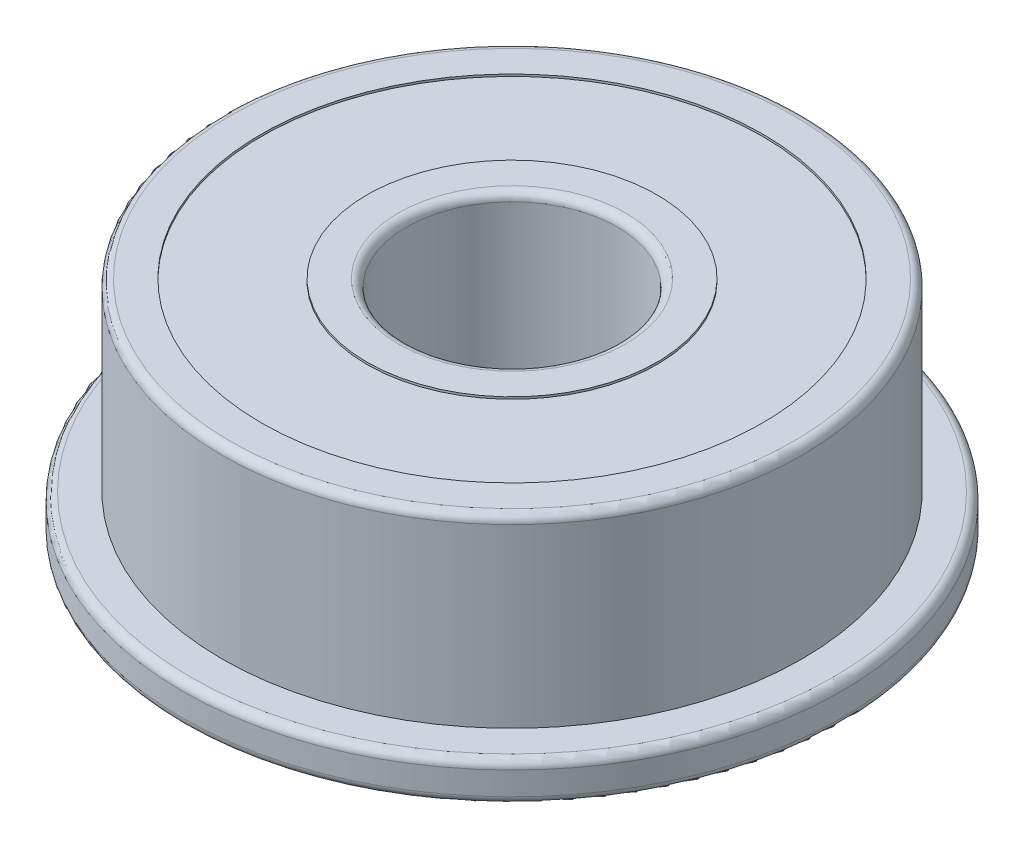
ISO-10303-21;
HEADER;
FILE_DESCRIPTION(('STEP AP214'),'2;1');
FILE_NAME('part.step','',(''),(''),'','','');
FILE_SCHEMA(('AUTOMOTIVE_DESIGN { 1 0 10303 214 1 1 1 1 }'));
ENDSEC;
DATA;
#1=APPLICATION_CONTEXT('core data for automotive mechanical design processes');
#2=APPLICATION_PROTOCOL_DEFINITION('international standard','automotive_design',2000,#1);
#3=PRODUCT_CONTEXT('',#1,'mechanical');
#4=PRODUCT('Part','Part','',(#3));
#5=PRODUCT_RELATED_PRODUCT_CATEGORY('part','',(#4));
#6=PRODUCT_DEFINITION_FORMATION('','',#4);
#7=PRODUCT_DEFINITION_CONTEXT('part definition',#1,'design');
#8=PRODUCT_DEFINITION('design','',#6,#7);
#9=PRODUCT_DEFINITION_SHAPE('','',#8);
#10=(LENGTH_UNIT() NAMED_UNIT(*) SI_UNIT(.MILLI.,.METRE.));
#11=(NAMED_UNIT(*) PLANE_ANGLE_UNIT() SI_UNIT($,.RADIAN.));
#12=(NAMED_UNIT(*) SI_UNIT($,.STERADIAN.) SOLID_ANGLE_UNIT());
#13=UNCERTAINTY_MEASURE_WITH_UNIT(LENGTH_MEASURE(1.E-05),#10,'distance_accuracy_value','');
#14=(GEOMETRIC_REPRESENTATION_CONTEXT(3) GLOBAL_UNCERTAINTY_ASSIGNED_CONTEXT((#13)) GLOBAL_UNIT_ASSIGNED_CONTEXT((#10,
#11,#12)) REPRESENTATION_CONTEXT('',''));
#15=CARTESIAN_POINT('',(0.,0.,0.));
#16=DIRECTION('',(0.,0.,1.));
#17=DIRECTION('',(1.,0.,0.));
#18=AXIS2_PLACEMENT_3D('',#15,#16,#17);
#19=CARTESIAN_POINT('',(0.,8.5,0.));
#20=DIRECTION('',(0.,1.,0.));
#21=DIRECTION('',(0.,0.,1.));
#22=AXIS2_PLACEMENT_3D('',#19,#20,#21);
#23=PLANE('',#22);
#24=CARTESIAN_POINT('',(0.,8.5,0.));
#25=DIRECTION('',(0.,1.,0.));
#26=DIRECTION('',(0.,0.,1.));
#27=AXIS2_PLACEMENT_3D('',#24,#25,#26);
#28=CIRCLE('',#27,4.31);
#29=CARTESIAN_POINT('',(0.,8.5,4.31));
#30=VERTEX_POINT('',#29);
#31=EDGE_CURVE('E10',#30,#30,#28,.F.);
#32=ORIENTED_EDGE('',*,*,#31,.T.);
#33=EDGE_LOOP('',(#32));
#34=FACE_BOUND('',#33,.T.);
#35=CARTESIAN_POINT('',(0.,8.5,0.));
#36=DIRECTION('',(0.,1.,0.));
#37=DIRECTION('',(0.,0.,1.));
#38=AXIS2_PLACEMENT_3D('',#35,#36,#37);
#39=CIRCLE('',#38,5.5);
#40=CARTESIAN_POINT('',(0.,8.5,5.5));
#41=VERTEX_POINT('',#40);
#42=EDGE_CURVE('E93',#41,#41,#39,.T.);
#43=ORIENTED_EDGE('',*,*,#42,.T.);
#44=EDGE_LOOP('',(#43));
#45=FACE_BOUND('',#44,.T.);
#46=ADVANCED_FACE('F33',(#34,#45),#23,.T.);
#47=CARTESIAN_POINT('',(0.,0.,0.));
#48=DIRECTION('',(0.,1.,0.));
#49=DIRECTION('',(0.,0.,1.));
#50=AXIS2_PLACEMENT_3D('',#47,#48,#49);
#51=PLANE('',#50);
#52=CARTESIAN_POINT('',(0.,0.,0.));
#53=DIRECTION('',(0.,1.,0.));
#54=DIRECTION('',(0.,0.,1.));
#55=AXIS2_PLACEMENT_3D('',#52,#53,#54);
#56=CIRCLE('',#55,4.31);
#57=CARTESIAN_POINT('',(0.,0.,4.31));
#58=VERTEX_POINT('',#57);
#59=EDGE_CURVE('E59',#58,#58,#56,.T.);
#60=ORIENTED_EDGE('',*,*,#59,.T.);
#61=EDGE_LOOP('',(#60));
#62=FACE_BOUND('',#61,.T.);
#63=CARTESIAN_POINT('',(0.,0.,0.));
#64=DIRECTION('',(0.,-1.,0.));
#65=DIRECTION('',(0.,0.,-1.));
#66=AXIS2_PLACEMENT_3D('',#63,#64,#65);
#67=CIRCLE('',#66,5.5);
#68=CARTESIAN_POINT('',(0.,0.,-5.5));
#69=VERTEX_POINT('',#68);
#70=EDGE_CURVE('E81',#69,#69,#67,.T.);
#71=ORIENTED_EDGE('',*,*,#70,.T.);
#72=EDGE_LOOP('',(#71));
#73=FACE_BOUND('',#72,.T.);
#74=ADVANCED_FACE('F131',(#62,#73),#51,.F.);
#75=CARTESIAN_POINT('',(0.,1.5,0.));
#76=DIRECTION('',(0.,-1.,0.));
#77=DIRECTION('',(0.,0.,-1.));
#78=AXIS2_PLACEMENT_3D('',#75,#76,#77);
#79=CYLINDRICAL_SURFACE('',#78,12.5);
#80=CARTESIAN_POINT('',(0.,1.19,0.));
#81=DIRECTION('',(0.,1.,0.));
#82=DIRECTION('',(0.,0.,1.));
#83=AXIS2_PLACEMENT_3D('',#80,#81,#82);
#84=CIRCLE('',#83,12.5);
#85=CARTESIAN_POINT('',(0.,1.19,12.5));
#86=VERTEX_POINT('',#85);
#87=EDGE_CURVE('E62',#86,#86,#84,.F.);
#88=ORIENTED_EDGE('',*,*,#87,.T.);
#89=EDGE_LOOP('',(#88));
#90=FACE_BOUND('',#89,.T.);
#91=CARTESIAN_POINT('',(0.,0.31,0.));
#92=DIRECTION('',(0.,1.,0.));
#93=DIRECTION('',(0.,0.,1.));
#94=AXIS2_PLACEMENT_3D('',#91,#92,#93);
#95=CIRCLE('',#94,12.5);
#96=CARTESIAN_POINT('',(0.,0.31,12.5));
#97=VERTEX_POINT('',#96);
#98=EDGE_CURVE('E65',#97,#97,#95,.T.);
#99=ORIENTED_EDGE('',*,*,#98,.T.);
#100=EDGE_LOOP('',(#99));
#101=FACE_BOUND('',#100,.T.);
#102=ADVANCED_FACE('F135',(#90,#101),#79,.T.);
#103=CARTESIAN_POINT('',(0.,1.5,0.));
#104=DIRECTION('',(0.,1.,0.));
#105=DIRECTION('',(0.,0.,1.));
#106=AXIS2_PLACEMENT_3D('',#103,#104,#105);
#107=PLANE('',#106);
#108=CARTESIAN_POINT('',(0.,1.5,0.));
#109=DIRECTION('',(0.,1.,0.));
#110=DIRECTION('',(0.,0.,1.));
#111=AXIS2_PLACEMENT_3D('',#108,#109,#110);
#112=CIRCLE('',#111,12.19);
#113=CARTESIAN_POINT('',(0.,1.5,12.19));
#114=VERTEX_POINT('',#113);
#115=EDGE_CURVE('E68',#114,#114,#112,.T.);
#116=ORIENTED_EDGE('',*,*,#115,.T.);
#117=EDGE_LOOP('',(#116));
#118=FACE_BOUND('',#117,.T.);
#119=CARTESIAN_POINT('',(0.,1.5,0.));
#120=DIRECTION('',(0.,1.,0.));
#121=DIRECTION('',(0.,0.,1.));
#122=AXIS2_PLACEMENT_3D('',#119,#120,#121);
#123=CIRCLE('',#122,11.);
#124=CARTESIAN_POINT('',(0.,1.5,11.));
#125=VERTEX_POINT('',#124);
#126=EDGE_CURVE('E71',#125,#125,#123,.T.);
#127=ORIENTED_EDGE('',*,*,#126,.F.);
#128=EDGE_LOOP('',(#127));
#129=FACE_BOUND('',#128,.T.);
#130=ADVANCED_FACE('F166',(#118,#129),#107,.T.);
#131=CARTESIAN_POINT('',(0.,0.,0.));
#132=DIRECTION('',(0.,1.,0.));
#133=DIRECTION('',(0.,0.,1.));
#134=AXIS2_PLACEMENT_3D('',#131,#132,#133);
#135=CIRCLE('',#134,12.19);
#136=CARTESIAN_POINT('',(0.,0.,12.19));
#137=VERTEX_POINT('',#136);
#138=EDGE_CURVE('E48',#137,#137,#135,.F.);
#139=ORIENTED_EDGE('',*,*,#138,.T.);
#140=EDGE_LOOP('',(#139));
#141=FACE_BOUND('',#140,.T.);
#142=CARTESIAN_POINT('',(0.,0.,0.));
#143=DIRECTION('',(0.,-1.,0.));
#144=DIRECTION('',(0.,0.,-1.));
#145=AXIS2_PLACEMENT_3D('',#142,#143,#144);
#146=CIRCLE('',#145,9.5);
#147=CARTESIAN_POINT('',(0.,0.,-9.5));
#148=VERTEX_POINT('',#147);
#149=EDGE_CURVE('E75',#148,#148,#146,.T.);
#150=ORIENTED_EDGE('',*,*,#149,.F.);
#151=EDGE_LOOP('',(#150));
#152=FACE_BOUND('',#151,.T.);
#153=ADVANCED_FACE('F128',(#141,#152),#51,.F.);
#154=CARTESIAN_POINT('',(0.,8.5,0.));
#155=DIRECTION('',(0.,-1.,0.));
#156=DIRECTION('',(0.,0.,-1.));
#157=AXIS2_PLACEMENT_3D('',#154,#155,#156);
#158=CYLINDRICAL_SURFACE('',#157,11.);
#159=CARTESIAN_POINT('',(0.,8.19,0.));
#160=DIRECTION('',(0.,1.,0.));
#161=DIRECTION('',(0.,0.,1.));
#162=AXIS2_PLACEMENT_3D('',#159,#160,#161);
#163=CIRCLE('',#162,11.);
#164=CARTESIAN_POINT('',(0.,8.19,11.));
#165=VERTEX_POINT('',#164);
#166=EDGE_CURVE('E40',#165,#165,#163,.F.);
#167=ORIENTED_EDGE('',*,*,#166,.T.);
#168=EDGE_LOOP('',(#167));
#169=FACE_BOUND('',#168,.T.);
#170=ORIENTED_EDGE('',*,*,#126,.T.);
#171=EDGE_LOOP('',(#170));
#172=FACE_BOUND('',#171,.T.);
#173=ADVANCED_FACE('F118',(#169,#172),#158,.T.);
#174=CARTESIAN_POINT('',(0.,8.5,0.));
#175=DIRECTION('',(0.,1.,0.));
#176=DIRECTION('',(0.,0.,1.));
#177=AXIS2_PLACEMENT_3D('',#174,#175,#176);
#178=CIRCLE('',#177,10.69);
#179=CARTESIAN_POINT('',(0.,8.5,10.69));
#180=VERTEX_POINT('',#179);
#181=EDGE_CURVE('E44',#180,#180,#178,.T.);
#182=ORIENTED_EDGE('',*,*,#181,.T.);
#183=EDGE_LOOP('',(#182));
#184=FACE_BOUND('',#183,.T.);
#185=CARTESIAN_POINT('',(0.,8.5,0.));
#186=DIRECTION('',(0.,1.,0.));
#187=DIRECTION('',(0.,0.,1.));
#188=AXIS2_PLACEMENT_3D('',#185,#186,#187);
#189=CIRCLE('',#188,9.5);
#190=CARTESIAN_POINT('',(0.,8.5,9.5));
#191=VERTEX_POINT('',#190);
#192=EDGE_CURVE('E87',#191,#191,#189,.T.);
#193=ORIENTED_EDGE('',*,*,#192,.F.);
#194=EDGE_LOOP('',(#193));
#195=FACE_BOUND('',#194,.T.);
#196=ADVANCED_FACE('F115',(#184,#195),#23,.T.);
#197=CARTESIAN_POINT('',(0.,0.,0.));
#198=DIRECTION('',(0.,1.,0.));
#199=DIRECTION('',(0.,0.,1.));
#200=AXIS2_PLACEMENT_3D('',#197,#198,#199);
#201=CYLINDRICAL_SURFACE('',#200,4.);
#202=CARTESIAN_POINT('',(0.,0.31,0.));
#203=DIRECTION('',(0.,1.,0.));
#204=DIRECTION('',(0.,0.,1.));
#205=AXIS2_PLACEMENT_3D('',#202,#203,#204);
#206=CIRCLE('',#205,4.);
#207=CARTESIAN_POINT('',(0.,0.31,4.));
#208=VERTEX_POINT('',#207);
#209=EDGE_CURVE('E53',#208,#208,#206,.F.);
#210=ORIENTED_EDGE('',*,*,#209,.T.);
#211=EDGE_LOOP('',(#210));
#212=FACE_BOUND('',#211,.T.);
#213=CARTESIAN_POINT('',(0.,8.19,0.));
#214=DIRECTION('',(0.,1.,0.));
#215=DIRECTION('',(0.,0.,1.));
#216=AXIS2_PLACEMENT_3D('',#213,#214,#215);
#217=CIRCLE('',#216,4.);
#218=CARTESIAN_POINT('',(0.,8.19,4.));
#219=VERTEX_POINT('',#218);
#220=EDGE_CURVE('E56',#219,#219,#217,.T.);
#221=ORIENTED_EDGE('',*,*,#220,.T.);
#222=EDGE_LOOP('',(#221));
#223=FACE_BOUND('',#222,.T.);
#224=ADVANCED_FACE('F117',(#212,#223),#201,.F.);
#225=CARTESIAN_POINT('',(0.,0.08,0.));
#226=DIRECTION('',(0.,-1.,0.));
#227=DIRECTION('',(0.,0.,-1.));
#228=AXIS2_PLACEMENT_3D('',#225,#226,#227);
#229=CYLINDRICAL_SURFACE('',#228,9.5);
#230=CARTESIAN_POINT('',(0.,0.08,0.));
#231=DIRECTION('',(0.,-1.,0.));
#232=DIRECTION('',(0.,0.,-1.));
#233=AXIS2_PLACEMENT_3D('',#230,#231,#232);
#234=CIRCLE('',#233,9.5);
#235=CARTESIAN_POINT('',(0.,0.08,-9.5));
#236=VERTEX_POINT('',#235);
#237=EDGE_CURVE('E74',#236,#236,#234,.T.);
#238=CARTESIAN_POINT('',(0.,0.08,-9.5));
#239=CARTESIAN_POINT('',(0.,0.0791666666666667,-9.5));
#240=CARTESIAN_POINT('',(0.,0.0783333333333333,-9.5));
#241=CARTESIAN_POINT('',(0.,0.0766666666666667,-9.5));
#242=CARTESIAN_POINT('',(0.,0.0758333333333333,-9.5));
#243=CARTESIAN_POINT('',(0.,0.0741666666666667,-9.5));
#244=CARTESIAN_POINT('',(0.,0.0733333333333333,-9.5));
#245=CARTESIAN_POINT('',(0.,0.0716666666666667,-9.5));
#246=CARTESIAN_POINT('',(0.,0.0708333333333333,-9.5));
#247=CARTESIAN_POINT('',(0.,0.0691666666666667,-9.5));
#248=CARTESIAN_POINT('',(0.,0.0683333333333333,-9.5));
#249=CARTESIAN_POINT('',(0.,0.0666666666666667,-9.5));
#250=CARTESIAN_POINT('',(0.,0.0658333333333333,-9.5));
#251=CARTESIAN_POINT('',(0.,0.0641666666666667,-9.5));
#252=CARTESIAN_POINT('',(0.,0.0633333333333333,-9.5));
#253=CARTESIAN_POINT('',(0.,0.0616666666666667,-9.5));
#254=CARTESIAN_POINT('',(0.,0.0608333333333333,-9.5));
#255=CARTESIAN_POINT('',(0.,0.0591666666666667,-9.5));
#256=CARTESIAN_POINT('',(0.,0.0583333333333333,-9.5));
#257=CARTESIAN_POINT('',(0.,0.0566666666666667,-9.5));
#258=CARTESIAN_POINT('',(0.,0.0558333333333333,-9.5));
#259=CARTESIAN_POINT('',(0.,0.0541666666666667,-9.5));
#260=CARTESIAN_POINT('',(0.,0.0533333333333333,-9.5));
#261=CARTESIAN_POINT('',(0.,0.0516666666666667,-9.5));
#262=CARTESIAN_POINT('',(0.,0.0508333333333333,-9.5));
#263=CARTESIAN_POINT('',(0.,0.0491666666666667,-9.5));
#264=CARTESIAN_POINT('',(0.,0.0483333333333333,-9.5));
#265=CARTESIAN_POINT('',(0.,0.0466666666666667,-9.5));
#266=CARTESIAN_POINT('',(0.,0.0458333333333333,-9.5));
#267=CARTESIAN_POINT('',(0.,0.0441666666666667,-9.5));
#268=CARTESIAN_POINT('',(0.,0.0433333333333333,-9.5));
#269=CARTESIAN_POINT('',(0.,0.0416666666666667,-9.5));
#270=CARTESIAN_POINT('',(0.,0.0408333333333333,-9.5));
#271=CARTESIAN_POINT('',(0.,0.0391666666666667,-9.5));
#272=CARTESIAN_POINT('',(0.,0.0383333333333333,-9.5));
#273=CARTESIAN_POINT('',(0.,0.0366666666666667,-9.5));
#274=CARTESIAN_POINT('',(0.,0.0358333333333333,-9.5));
#275=CARTESIAN_POINT('',(0.,0.0341666666666667,-9.5));
#276=CARTESIAN_POINT('',(0.,0.0333333333333333,-9.5));
#277=CARTESIAN_POINT('',(0.,0.0316666666666667,-9.5));
#278=CARTESIAN_POINT('',(0.,0.0308333333333333,-9.5));
#279=CARTESIAN_POINT('',(0.,0.0291666666666667,-9.5));
#280=CARTESIAN_POINT('',(0.,0.0283333333333333,-9.5));
#281=CARTESIAN_POINT('',(0.,0.0266666666666667,-9.5));
#282=CARTESIAN_POINT('',(0.,0.0258333333333333,-9.5));
#283=CARTESIAN_POINT('',(0.,0.0241666666666667,-9.5));
#284=CARTESIAN_POINT('',(0.,0.0233333333333333,-9.5));
#285=CARTESIAN_POINT('',(0.,0.0216666666666667,-9.5));
#286=CARTESIAN_POINT('',(0.,0.0208333333333333,-9.5));
#287=CARTESIAN_POINT('',(0.,0.0191666666666667,-9.5));
#288=CARTESIAN_POINT('',(0.,0.0183333333333333,-9.5));
#289=CARTESIAN_POINT('',(0.,0.0166666666666667,-9.5));
#290=CARTESIAN_POINT('',(0.,0.0158333333333333,-9.5));
#291=CARTESIAN_POINT('',(0.,0.0141666666666667,-9.5));
#292=CARTESIAN_POINT('',(0.,0.0133333333333333,-9.5));
#293=CARTESIAN_POINT('',(0.,0.0116666666666667,-9.5));
#294=CARTESIAN_POINT('',(0.,0.0108333333333333,-9.5));
#295=CARTESIAN_POINT('',(0.,0.00916666666666667,-9.5));
#296=CARTESIAN_POINT('',(0.,0.00833333333333334,-9.5));
#297=CARTESIAN_POINT('',(0.,0.00666666666666667,-9.5));
#298=CARTESIAN_POINT('',(0.,0.00583333333333333,-9.5));
#299=CARTESIAN_POINT('',(0.,0.00416666666666667,-9.5));
#300=CARTESIAN_POINT('',(0.,0.00333333333333334,-9.5));
#301=CARTESIAN_POINT('',(0.,0.00166666666666667,-9.5));
#302=CARTESIAN_POINT('',(0.,0.000833333333333335,-9.5));
#303=CARTESIAN_POINT('',(0.,0.,-9.5));
#304=B_SPLINE_CURVE_WITH_KNOTS('',3,(#238,#239,#240,#241,#242,#243,#244,#245,#246,#247,#248,
#249,#250,#251,#252,#253,#254,#255,#256,#257,#258,#259,#260,#261,#262,#263,#264,#265,#266,#267,
#268,#269,#270,#271,#272,#273,#274,#275,#276,#277,#278,#279,#280,#281,#282,#283,#284,#285,#286,
#287,#288,#289,#290,#291,#292,#293,#294,#295,#296,#297,#298,#299,#300,#301,#302,#303),
.UNSPECIFIED.,.F.,.F.,(4,2,2,2,2,2,2,2,2,2,2,2,2,2,2,2,2,2,2,2,2,2,2,2,2,2,2,2,2,2,2,2,4),(0.,
0.00250000000000001,0.00500000000000001,0.00750000000000001,0.01,0.0125,0.015,0.0175,0.02,
0.0225,0.025,0.0275,0.03,0.0325,0.035,0.0375,0.04,0.0425,0.045,0.0475,0.05,0.0525,0.055,0.0575,
0.06,0.0625,0.065,0.0675,0.07,0.0725,0.075,0.0775,0.08),.UNSPECIFIED.);
#305=EDGE_CURVE('BSEAM125',#236,#148,#304,.T.);
#306=ORIENTED_EDGE('',*,*,#237,.F.);
#307=ORIENTED_EDGE('',*,*,#149,.T.);
#308=ORIENTED_EDGE('',*,*,#305,.T.);
#309=ORIENTED_EDGE('',*,*,#305,.F.);
#310=EDGE_LOOP('',(#306,#308,#307,#309));
#311=FACE_BOUND('',#310,.T.);
#312=ADVANCED_FACE('F125',(#311),#229,.F.);
#313=CARTESIAN_POINT('',(0.,0.08,0.));
#314=DIRECTION('',(0.,-1.,0.));
#315=DIRECTION('',(0.,0.,-1.));
#316=AXIS2_PLACEMENT_3D('',#313,#314,#315);
#317=PLANE('',#316);
#318=CARTESIAN_POINT('',(0.,0.08,0.));
#319=DIRECTION('',(0.,-1.,0.));
#320=DIRECTION('',(0.,0.,-1.));
#321=AXIS2_PLACEMENT_3D('',#318,#319,#320);
#322=CIRCLE('',#321,5.5);
#323=CARTESIAN_POINT('',(0.,0.08,-5.5));
#324=VERTEX_POINT('',#323);
#325=EDGE_CURVE('E78',#324,#324,#322,.T.);
#326=ORIENTED_EDGE('',*,*,#325,.F.);
#327=EDGE_LOOP('',(#326));
#328=FACE_BOUND('',#327,.T.);
#329=ORIENTED_EDGE('',*,*,#237,.T.);
#330=EDGE_LOOP('',(#329));
#331=FACE_BOUND('',#330,.T.);
#332=ADVANCED_FACE('F152',(#328,#331),#317,.T.);
#333=CARTESIAN_POINT('',(0.,0.08,0.));
#334=DIRECTION('',(0.,-1.,0.));
#335=DIRECTION('',(0.,0.,-1.));
#336=AXIS2_PLACEMENT_3D('',#333,#334,#335);
#337=CYLINDRICAL_SURFACE('',#336,5.5);
#338=CARTESIAN_POINT('',(0.,0.08,-5.5));
#339=CARTESIAN_POINT('',(0.,0.0791666666666667,-5.5));
#340=CARTESIAN_POINT('',(0.,0.0783333333333333,-5.5));
#341=CARTESIAN_POINT('',(0.,0.0766666666666667,-5.5));
#342=CARTESIAN_POINT('',(0.,0.0758333333333333,-5.5));
#343=CARTESIAN_POINT('',(0.,0.0741666666666667,-5.5));
#344=CARTESIAN_POINT('',(0.,0.0733333333333333,-5.5));
#345=CARTESIAN_POINT('',(0.,0.0716666666666667,-5.5));
#346=CARTESIAN_POINT('',(0.,0.0708333333333333,-5.5));
#347=CARTESIAN_POINT('',(0.,0.0691666666666667,-5.5));
#348=CARTESIAN_POINT('',(0.,0.0683333333333333,-5.5));
#349=CARTESIAN_POINT('',(0.,0.0666666666666667,-5.5));
#350=CARTESIAN_POINT('',(0.,0.0658333333333333,-5.5));
#351=CARTESIAN_POINT('',(0.,0.0641666666666667,-5.5));
#352=CARTESIAN_POINT('',(0.,0.0633333333333334,-5.5));
#353=CARTESIAN_POINT('',(0.,0.0616666666666667,-5.5));
#354=CARTESIAN_POINT('',(0.,0.0608333333333333,-5.5));
#355=CARTESIAN_POINT('',(0.,0.0591666666666667,-5.5));
#356=CARTESIAN_POINT('',(0.,0.0583333333333333,-5.5));
#357=CARTESIAN_POINT('',(0.,0.0566666666666667,-5.5));
#358=CARTESIAN_POINT('',(0.,0.0558333333333333,-5.5));
#359=CARTESIAN_POINT('',(0.,0.0541666666666667,-5.5));
#360=CARTESIAN_POINT('',(0.,0.0533333333333333,-5.5));
#361=CARTESIAN_POINT('',(0.,0.0516666666666667,-5.5));
#362=CARTESIAN_POINT('',(0.,0.0508333333333333,-5.5));
#363=CARTESIAN_POINT('',(0.,0.0491666666666667,-5.5));
#364=CARTESIAN_POINT('',(0.,0.0483333333333333,-5.5));
#365=CARTESIAN_POINT('',(0.,0.0466666666666667,-5.5));
#366=CARTESIAN_POINT('',(0.,0.0458333333333333,-5.5));
#367=CARTESIAN_POINT('',(0.,0.0441666666666667,-5.5));
#368=CARTESIAN_POINT('',(0.,0.0433333333333333,-5.5));
#369=CARTESIAN_POINT('',(0.,0.0416666666666667,-5.5));
#370=CARTESIAN_POINT('',(0.,0.0408333333333333,-5.5));
#371=CARTESIAN_POINT('',(0.,0.0391666666666667,-5.5));
#372=CARTESIAN_POINT('',(0.,0.0383333333333333,-5.5));
#373=CARTESIAN_POINT('',(0.,0.0366666666666667,-5.5));
#374=CARTESIAN_POINT('',(0.,0.0358333333333333,-5.5));
#375=CARTESIAN_POINT('',(0.,0.0341666666666667,-5.5));
#376=CARTESIAN_POINT('',(0.,0.0333333333333333,-5.5));
#377=CARTESIAN_POINT('',(0.,0.0316666666666667,-5.5));
#378=CARTESIAN_POINT('',(0.,0.0308333333333333,-5.5));
#379=CARTESIAN_POINT('',(0.,0.0291666666666667,-5.5));
#380=CARTESIAN_POINT('',(0.,0.0283333333333333,-5.5));
#381=CARTESIAN_POINT('',(0.,0.0266666666666667,-5.5));
#382=CARTESIAN_POINT('',(0.,0.0258333333333333,-5.5));
#383=CARTESIAN_POINT('',(0.,0.0241666666666667,-5.5));
#384=CARTESIAN_POINT('',(0.,0.0233333333333333,-5.5));
#385=CARTESIAN_POINT('',(0.,0.0216666666666667,-5.5));
#386=CARTESIAN_POINT('',(0.,0.0208333333333333,-5.5));
#387=CARTESIAN_POINT('',(0.,0.0191666666666667,-5.5));
#388=CARTESIAN_POINT('',(0.,0.0183333333333333,-5.5));
#389=CARTESIAN_POINT('',(0.,0.0166666666666667,-5.5));
#390=CARTESIAN_POINT('',(0.,0.0158333333333333,-5.5));
#391=CARTESIAN_POINT('',(0.,0.0141666666666667,-5.5));
#392=CARTESIAN_POINT('',(0.,0.0133333333333333,-5.5));
#393=CARTESIAN_POINT('',(0.,0.0116666666666667,-5.5));
#394=CARTESIAN_POINT('',(0.,0.0108333333333333,-5.5));
#395=CARTESIAN_POINT('',(0.,0.00916666666666667,-5.5));
#396=CARTESIAN_POINT('',(0.,0.00833333333333334,-5.5));
#397=CARTESIAN_POINT('',(0.,0.00666666666666667,-5.5));
#398=CARTESIAN_POINT('',(0.,0.00583333333333333,-5.5));
#399=CARTESIAN_POINT('',(0.,0.00416666666666667,-5.5));
#400=CARTESIAN_POINT('',(0.,0.00333333333333334,-5.5));
#401=CARTESIAN_POINT('',(0.,0.00166666666666667,-5.5));
#402=CARTESIAN_POINT('',(0.,0.000833333333333335,-5.5));
#403=CARTESIAN_POINT('',(0.,0.,-5.5));
#404=B_SPLINE_CURVE_WITH_KNOTS('',3,(#338,#339,#340,#341,#342,#343,#344,#345,#346,#347,#348,
#349,#350,#351,#352,#353,#354,#355,#356,#357,#358,#359,#360,#361,#362,#363,#364,#365,#366,#367,
#368,#369,#370,#371,#372,#373,#374,#375,#376,#377,#378,#379,#380,#381,#382,#383,#384,#385,#386,
#387,#388,#389,#390,#391,#392,#393,#394,#395,#396,#397,#398,#399,#400,#401,#402,#403),
.UNSPECIFIED.,.F.,.F.,(4,2,2,2,2,2,2,2,2,2,2,2,2,2,2,2,2,2,2,2,2,2,2,2,2,2,2,2,2,2,2,2,4),(0.,
0.00249999999999999,0.005,0.00749999999999999,0.01,0.0125,0.015,0.0175,0.02,0.0225,0.025,0.0275,
0.03,0.0325,0.035,0.0375,0.04,0.0425,0.045,0.0475,0.05,0.0525,0.055,0.0575,0.06,0.0625,0.065,
0.0675,0.07,0.0725,0.075,0.0775,0.08),.UNSPECIFIED.);
#405=EDGE_CURVE('BSEAM111',#324,#69,#404,.T.);
#406=ORIENTED_EDGE('',*,*,#325,.T.);
#407=ORIENTED_EDGE('',*,*,#70,.F.);
#408=ORIENTED_EDGE('',*,*,#405,.T.);
#409=ORIENTED_EDGE('',*,*,#405,.F.);
#410=EDGE_LOOP('',(#406,#408,#407,#409));
#411=FACE_BOUND('',#410,.T.);
#412=ADVANCED_FACE('F111',(#411),#337,.T.);
#413=CARTESIAN_POINT('',(0.,8.42,0.));
#414=DIRECTION('',(0.,1.,0.));
#415=DIRECTION('',(0.,0.,1.));
#416=AXIS2_PLACEMENT_3D('',#413,#414,#415);
#417=CYLINDRICAL_SURFACE('',#416,9.5);
#418=CARTESIAN_POINT('',(0.,8.42,0.));
#419=DIRECTION('',(0.,1.,0.));
#420=DIRECTION('',(0.,0.,1.));
#421=AXIS2_PLACEMENT_3D('',#418,#419,#420);
#422=CIRCLE('',#421,9.5);
#423=CARTESIAN_POINT('',(0.,8.42,9.5));
#424=VERTEX_POINT('',#423);
#425=EDGE_CURVE('E84',#424,#424,#422,.T.);
#426=CARTESIAN_POINT('',(0.,8.42,9.5));
#427=CARTESIAN_POINT('',(0.,8.42083333333333,9.5));
#428=CARTESIAN_POINT('',(0.,8.42166666666667,9.5));
#429=CARTESIAN_POINT('',(0.,8.42333333333333,9.5));
#430=CARTESIAN_POINT('',(0.,8.42416666666667,9.5));
#431=CARTESIAN_POINT('',(0.,8.42583333333333,9.5));
#432=CARTESIAN_POINT('',(0.,8.42666666666667,9.5));
#433=CARTESIAN_POINT('',(0.,8.42833333333333,9.5));
#434=CARTESIAN_POINT('',(0.,8.42916666666667,9.5));
#435=CARTESIAN_POINT('',(0.,8.43083333333333,9.5));
#436=CARTESIAN_POINT('',(0.,8.43166666666666,9.5));
#437=CARTESIAN_POINT('',(0.,8.43333333333333,9.5));
#438=CARTESIAN_POINT('',(0.,8.43416666666667,9.5));
#439=CARTESIAN_POINT('',(0.,8.43583333333333,9.5));
#440=CARTESIAN_POINT('',(0.,8.43666666666667,9.5));
#441=CARTESIAN_POINT('',(0.,8.43833333333333,9.5));
#442=CARTESIAN_POINT('',(0.,8.43916666666667,9.5));
#443=CARTESIAN_POINT('',(0.,8.44083333333333,9.5));
#444=CARTESIAN_POINT('',(0.,8.44166666666667,9.5));
#445=CARTESIAN_POINT('',(0.,8.44333333333333,9.5));
#446=CARTESIAN_POINT('',(0.,8.44416666666667,9.5));
#447=CARTESIAN_POINT('',(0.,8.44583333333333,9.5));
#448=CARTESIAN_POINT('',(0.,8.44666666666667,9.5));
#449=CARTESIAN_POINT('',(0.,8.44833333333333,9.5));
#450=CARTESIAN_POINT('',(0.,8.44916666666666,9.5));
#451=CARTESIAN_POINT('',(0.,8.45083333333333,9.5));
#452=CARTESIAN_POINT('',(0.,8.45166666666667,9.5));
#453=CARTESIAN_POINT('',(0.,8.45333333333333,9.5));
#454=CARTESIAN_POINT('',(0.,8.45416666666667,9.5));
#455=CARTESIAN_POINT('',(0.,8.45583333333333,9.5));
#456=CARTESIAN_POINT('',(0.,8.45666666666667,9.5));
#457=CARTESIAN_POINT('',(0.,8.45833333333333,9.5));
#458=CARTESIAN_POINT('',(0.,8.45916666666666,9.5));
#459=CARTESIAN_POINT('',(0.,8.46083333333333,9.5));
#460=CARTESIAN_POINT('',(0.,8.46166666666667,9.5));
#461=CARTESIAN_POINT('',(0.,8.46333333333333,9.5));
#462=CARTESIAN_POINT('',(0.,8.46416666666667,9.5));
#463=CARTESIAN_POINT('',(0.,8.46583333333333,9.5));
#464=CARTESIAN_POINT('',(0.,8.46666666666667,9.5));
#465=CARTESIAN_POINT('',(0.,8.46833333333333,9.5));
#466=CARTESIAN_POINT('',(0.,8.46916666666667,9.5));
#467=CARTESIAN_POINT('',(0.,8.47083333333333,9.5));
#468=CARTESIAN_POINT('',(0.,8.47166666666667,9.5));
#469=CARTESIAN_POINT('',(0.,8.47333333333333,9.5));
#470=CARTESIAN_POINT('',(0.,8.47416666666667,9.5));
#471=CARTESIAN_POINT('',(0.,8.47583333333333,9.5));
#472=CARTESIAN_POINT('',(0.,8.47666666666666,9.5));
#473=CARTESIAN_POINT('',(0.,8.47833333333333,9.5));
#474=CARTESIAN_POINT('',(0.,8.47916666666667,9.5));
#475=CARTESIAN_POINT('',(0.,8.48083333333333,9.5));
#476=CARTESIAN_POINT('',(0.,8.48166666666667,9.5));
#477=CARTESIAN_POINT('',(0.,8.48333333333333,9.5));
#478=CARTESIAN_POINT('',(0.,8.48416666666667,9.5));
#479=CARTESIAN_POINT('',(0.,8.48583333333333,9.5));
#480=CARTESIAN_POINT('',(0.,8.48666666666667,9.5));
#481=CARTESIAN_POINT('',(0.,8.48833333333333,9.5));
#482=CARTESIAN_POINT('',(0.,8.48916666666667,9.5));
#483=CARTESIAN_POINT('',(0.,8.49083333333333,9.5));
#484=CARTESIAN_POINT('',(0.,8.49166666666667,9.5));
#485=CARTESIAN_POINT('',(0.,8.49333333333333,9.5));
#486=CARTESIAN_POINT('',(0.,8.49416666666666,9.5));
#487=CARTESIAN_POINT('',(0.,8.49583333333333,9.5));
#488=CARTESIAN_POINT('',(0.,8.49666666666667,9.5));
#489=CARTESIAN_POINT('',(0.,8.49833333333333,9.5));
#490=CARTESIAN_POINT('',(0.,8.49916666666667,9.5));
#491=CARTESIAN_POINT('',(0.,8.5,9.5));
#492=B_SPLINE_CURVE_WITH_KNOTS('',3,(#426,#427,#428,#429,#430,#431,#432,#433,#434,#435,#436,
#437,#438,#439,#440,#441,#442,#443,#444,#445,#446,#447,#448,#449,#450,#451,#452,#453,#454,#455,
#456,#457,#458,#459,#460,#461,#462,#463,#464,#465,#466,#467,#468,#469,#470,#471,#472,#473,#474,
#475,#476,#477,#478,#479,#480,#481,#482,#483,#484,#485,#486,#487,#488,#489,#490,#491),
.UNSPECIFIED.,.F.,.F.,(4,2,2,2,2,2,2,2,2,2,2,2,2,2,2,2,2,2,2,2,2,2,2,2,2,2,2,2,2,2,2,2,4),(0.,
0.00250000000000077,0.00500000000000153,0.00750000000000056,0.0100000000000013,
0.0125000000000004,0.0150000000000011,0.0175000000000002,0.0200000000000009,0.0225000000000017,
0.0250000000000007,0.0275000000000015,0.0300000000000005,0.0325000000000013,0.0350000000000003,
0.0375000000000011,0.0400000000000001,0.0425000000000009,0.0450000000000016,0.0475000000000007,
0.0500000000000014,0.0525000000000005,0.0550000000000012,0.0575000000000003,0.060000000000001,
0.0625000000000018,0.0650000000000008,0.0675000000000016,0.0700000000000006,0.0725000000000014,
0.0750000000000004,0.0775000000000012,0.0800000000000002),.UNSPECIFIED.);
#493=EDGE_CURVE('BSEAM105',#424,#191,#492,.T.);
#494=ORIENTED_EDGE('',*,*,#425,.F.);
#495=ORIENTED_EDGE('',*,*,#192,.T.);
#496=ORIENTED_EDGE('',*,*,#493,.T.);
#497=ORIENTED_EDGE('',*,*,#493,.F.);
#498=EDGE_LOOP('',(#494,#496,#495,#497));
#499=FACE_BOUND('',#498,.T.);
#500=ADVANCED_FACE('F105',(#499),#417,.F.);
#501=CARTESIAN_POINT('',(0.,8.42,0.));
#502=DIRECTION('',(0.,1.,0.));
#503=DIRECTION('',(0.,0.,1.));
#504=AXIS2_PLACEMENT_3D('',#501,#502,#503);
#505=PLANE('',#504);
#506=CARTESIAN_POINT('',(0.,8.42,0.));
#507=DIRECTION('',(0.,1.,0.));
#508=DIRECTION('',(0.,0.,1.));
#509=AXIS2_PLACEMENT_3D('',#506,#507,#508);
#510=CIRCLE('',#509,5.5);
#511=CARTESIAN_POINT('',(0.,8.42,5.5));
#512=VERTEX_POINT('',#511);
#513=EDGE_CURVE('E90',#512,#512,#510,.T.);
#514=ORIENTED_EDGE('',*,*,#513,.F.);
#515=EDGE_LOOP('',(#514));
#516=FACE_BOUND('',#515,.T.);
#517=ORIENTED_EDGE('',*,*,#425,.T.);
#518=EDGE_LOOP('',(#517));
#519=FACE_BOUND('',#518,.T.);
#520=ADVANCED_FACE('F102',(#516,#519),#505,.T.);
#521=CARTESIAN_POINT('',(0.,8.42,0.));
#522=DIRECTION('',(0.,1.,0.));
#523=DIRECTION('',(0.,0.,1.));
#524=AXIS2_PLACEMENT_3D('',#521,#522,#523);
#525=CYLINDRICAL_SURFACE('',#524,5.5);
#526=CARTESIAN_POINT('',(0.,8.42,5.5));
#527=CARTESIAN_POINT('',(0.,8.42083333333333,5.5));
#528=CARTESIAN_POINT('',(0.,8.42166666666667,5.5));
#529=CARTESIAN_POINT('',(0.,8.42333333333333,5.5));
#530=CARTESIAN_POINT('',(0.,8.42416666666667,5.5));
#531=CARTESIAN_POINT('',(0.,8.42583333333333,5.5));
#532=CARTESIAN_POINT('',(0.,8.42666666666667,5.5));
#533=CARTESIAN_POINT('',(0.,8.42833333333333,5.5));
#534=CARTESIAN_POINT('',(0.,8.42916666666667,5.5));
#535=CARTESIAN_POINT('',(0.,8.43083333333333,5.5));
#536=CARTESIAN_POINT('',(0.,8.43166666666666,5.5));
#537=CARTESIAN_POINT('',(0.,8.43333333333333,5.5));
#538=CARTESIAN_POINT('',(0.,8.43416666666667,5.5));
#539=CARTESIAN_POINT('',(0.,8.43583333333333,5.5));
#540=CARTESIAN_POINT('',(0.,8.43666666666667,5.5));
#541=CARTESIAN_POINT('',(0.,8.43833333333333,5.5));
#542=CARTESIAN_POINT('',(0.,8.43916666666667,5.5));
#543=CARTESIAN_POINT('',(0.,8.44083333333333,5.5));
#544=CARTESIAN_POINT('',(0.,8.44166666666667,5.5));
#545=CARTESIAN_POINT('',(0.,8.44333333333333,5.5));
#546=CARTESIAN_POINT('',(0.,8.44416666666667,5.5));
#547=CARTESIAN_POINT('',(0.,8.44583333333333,5.5));
#548=CARTESIAN_POINT('',(0.,8.44666666666667,5.5));
#549=CARTESIAN_POINT('',(0.,8.44833333333333,5.5));
#550=CARTESIAN_POINT('',(0.,8.44916666666666,5.5));
#551=CARTESIAN_POINT('',(0.,8.45083333333333,5.5));
#552=CARTESIAN_POINT('',(0.,8.45166666666667,5.5));
#553=CARTESIAN_POINT('',(0.,8.45333333333333,5.5));
#554=CARTESIAN_POINT('',(0.,8.45416666666667,5.5));
#555=CARTESIAN_POINT('',(0.,8.45583333333333,5.5));
#556=CARTESIAN_POINT('',(0.,8.45666666666667,5.5));
#557=CARTESIAN_POINT('',(0.,8.45833333333333,5.5));
#558=CARTESIAN_POINT('',(0.,8.45916666666666,5.5));
#559=CARTESIAN_POINT('',(0.,8.46083333333333,5.5));
#560=CARTESIAN_POINT('',(0.,8.46166666666667,5.5));
#561=CARTESIAN_POINT('',(0.,8.46333333333333,5.5));
#562=CARTESIAN_POINT('',(0.,8.46416666666667,5.5));
#563=CARTESIAN_POINT('',(0.,8.46583333333333,5.5));
#564=CARTESIAN_POINT('',(0.,8.46666666666667,5.5));
#565=CARTESIAN_POINT('',(0.,8.46833333333333,5.5));
#566=CARTESIAN_POINT('',(0.,8.46916666666667,5.5));
#567=CARTESIAN_POINT('',(0.,8.47083333333333,5.5));
#568=CARTESIAN_POINT('',(0.,8.47166666666667,5.5));
#569=CARTESIAN_POINT('',(0.,8.47333333333333,5.5));
#570=CARTESIAN_POINT('',(0.,8.47416666666667,5.5));
#571=CARTESIAN_POINT('',(0.,8.47583333333333,5.5));
#572=CARTESIAN_POINT('',(0.,8.47666666666666,5.5));
#573=CARTESIAN_POINT('',(0.,8.47833333333333,5.5));
#574=CARTESIAN_POINT('',(0.,8.47916666666667,5.5));
#575=CARTESIAN_POINT('',(0.,8.48083333333333,5.5));
#576=CARTESIAN_POINT('',(0.,8.48166666666667,5.5));
#577=CARTESIAN_POINT('',(0.,8.48333333333333,5.5));
#578=CARTESIAN_POINT('',(0.,8.48416666666667,5.5));
#579=CARTESIAN_POINT('',(0.,8.48583333333333,5.5));
#580=CARTESIAN_POINT('',(0.,8.48666666666667,5.5));
#581=CARTESIAN_POINT('',(0.,8.48833333333333,5.5));
#582=CARTESIAN_POINT('',(0.,8.48916666666667,5.5));
#583=CARTESIAN_POINT('',(0.,8.49083333333333,5.5));
#584=CARTESIAN_POINT('',(0.,8.49166666666667,5.5));
#585=CARTESIAN_POINT('',(0.,8.49333333333333,5.5));
#586=CARTESIAN_POINT('',(0.,8.49416666666666,5.5));
#587=CARTESIAN_POINT('',(0.,8.49583333333333,5.5));
#588=CARTESIAN_POINT('',(0.,8.49666666666667,5.5));
#589=CARTESIAN_POINT('',(0.,8.49833333333333,5.5));
#590=CARTESIAN_POINT('',(0.,8.49916666666667,5.5));
#591=CARTESIAN_POINT('',(0.,8.5,5.5));
#592=B_SPLINE_CURVE_WITH_KNOTS('',3,(#526,#527,#528,#529,#530,#531,#532,#533,#534,#535,#536,
#537,#538,#539,#540,#541,#542,#543,#544,#545,#546,#547,#548,#549,#550,#551,#552,#553,#554,#555,
#556,#557,#558,#559,#560,#561,#562,#563,#564,#565,#566,#567,#568,#569,#570,#571,#572,#573,#574,
#575,#576,#577,#578,#579,#580,#581,#582,#583,#584,#585,#586,#587,#588,#589,#590,#591),
.UNSPECIFIED.,.F.,.F.,(4,2,2,2,2,2,2,2,2,2,2,2,2,2,2,2,2,2,2,2,2,2,2,2,2,2,2,2,2,2,2,2,4),(0.,
0.00249999999999903,0.0049999999999998,0.00749999999999883,0.00999999999999959,
0.0124999999999986,0.0149999999999994,0.0174999999999984,0.0199999999999992,0.0225,
0.024999999999999,0.0274999999999997,0.0299999999999988,0.0324999999999995,0.0349999999999986,
0.0374999999999993,0.0399999999999984,0.0424999999999991,0.0449999999999999,0.0474999999999989,
0.0499999999999997,0.0524999999999987,0.0549999999999995,0.0574999999999985,0.0599999999999993,
0.0625000000000001,0.0649999999999991,0.0674999999999999,0.0699999999999989,0.0724999999999996,
0.0749999999999987,0.0774999999999994,0.0799999999999985),.UNSPECIFIED.);
#593=EDGE_CURVE('BSEAM99',#512,#41,#592,.T.);
#594=ORIENTED_EDGE('',*,*,#513,.T.);
#595=ORIENTED_EDGE('',*,*,#42,.F.);
#596=ORIENTED_EDGE('',*,*,#593,.T.);
#597=ORIENTED_EDGE('',*,*,#593,.F.);
#598=EDGE_LOOP('',(#594,#596,#595,#597));
#599=FACE_BOUND('',#598,.T.);
#600=ADVANCED_FACE('F99',(#599),#525,.T.);
#601=CARTESIAN_POINT('',(0.,1.19,0.));
#602=DIRECTION('',(0.,1.,0.));
#603=DIRECTION('',(0.,0.,1.));
#604=AXIS2_PLACEMENT_3D('',#601,#602,#603);
#605=TOROIDAL_SURFACE('',#604,12.19,0.31);
#606=ORIENTED_EDGE('',*,*,#87,.F.);
#607=EDGE_LOOP('',(#606));
#608=FACE_BOUND('',#607,.T.);
#609=ORIENTED_EDGE('',*,*,#115,.F.);
#610=EDGE_LOOP('',(#609));
#611=FACE_BOUND('',#610,.T.);
#612=ADVANCED_FACE('F141',(#608,#611),#605,.T.);
#613=CARTESIAN_POINT('',(0.,0.31,0.));
#614=DIRECTION('',(0.,1.,0.));
#615=DIRECTION('',(0.,0.,1.));
#616=AXIS2_PLACEMENT_3D('',#613,#614,#615);
#617=TOROIDAL_SURFACE('',#616,4.31,0.31);
#618=ORIENTED_EDGE('',*,*,#209,.F.);
#619=EDGE_LOOP('',(#618));
#620=FACE_BOUND('',#619,.T.);
#621=ORIENTED_EDGE('',*,*,#59,.F.);
#622=EDGE_LOOP('',(#621));
#623=FACE_BOUND('',#622,.T.);
#624=ADVANCED_FACE('F146',(#620,#623),#617,.T.);
#625=CARTESIAN_POINT('',(0.,0.31,0.));
#626=DIRECTION('',(0.,1.,0.));
#627=DIRECTION('',(0.,0.,1.));
#628=AXIS2_PLACEMENT_3D('',#625,#626,#627);
#629=TOROIDAL_SURFACE('',#628,12.19,0.31);
#630=ORIENTED_EDGE('',*,*,#138,.F.);
#631=EDGE_LOOP('',(#630));
#632=FACE_BOUND('',#631,.T.);
#633=ORIENTED_EDGE('',*,*,#98,.F.);
#634=EDGE_LOOP('',(#633));
#635=FACE_BOUND('',#634,.T.);
#636=ADVANCED_FACE('F179',(#632,#635),#629,.T.);
#637=CARTESIAN_POINT('',(0.,8.19,0.));
#638=DIRECTION('',(0.,1.,0.));
#639=DIRECTION('',(0.,0.,1.));
#640=AXIS2_PLACEMENT_3D('',#637,#638,#639);
#641=TOROIDAL_SURFACE('',#640,10.69,0.31);
#642=ORIENTED_EDGE('',*,*,#166,.F.);
#643=EDGE_LOOP('',(#642));
#644=FACE_BOUND('',#643,.T.);
#645=ORIENTED_EDGE('',*,*,#181,.F.);
#646=EDGE_LOOP('',(#645));
#647=FACE_BOUND('',#646,.T.);
#648=ADVANCED_FACE('F182',(#644,#647),#641,.T.);
#649=CARTESIAN_POINT('',(0.,8.19,0.));
#650=DIRECTION('',(0.,1.,0.));
#651=DIRECTION('',(0.,0.,1.));
#652=AXIS2_PLACEMENT_3D('',#649,#650,#651);
#653=TOROIDAL_SURFACE('',#652,4.31,0.31);
#654=ORIENTED_EDGE('',*,*,#31,.F.);
#655=EDGE_LOOP('',(#654));
#656=FACE_BOUND('',#655,.T.);
#657=ORIENTED_EDGE('',*,*,#220,.F.);
#658=EDGE_LOOP('',(#657));
#659=FACE_BOUND('',#658,.T.);
#660=ADVANCED_FACE('F35',(#656,#659),#653,.T.);
#661=CLOSED_SHELL('',(#46,#74,#102,#130,#153,#173,#196,#224,#312,#332,#412,#500,#520,#600,#612,
#624,#636,#648,#660));
#662=MANIFOLD_SOLID_BREP('B2',#661);
#663=ADVANCED_BREP_SHAPE_REPRESENTATION('',(#18,#662),#14);
#664=SHAPE_DEFINITION_REPRESENTATION(#9,#663);
ENDSEC;
END-ISO-10303-21;
